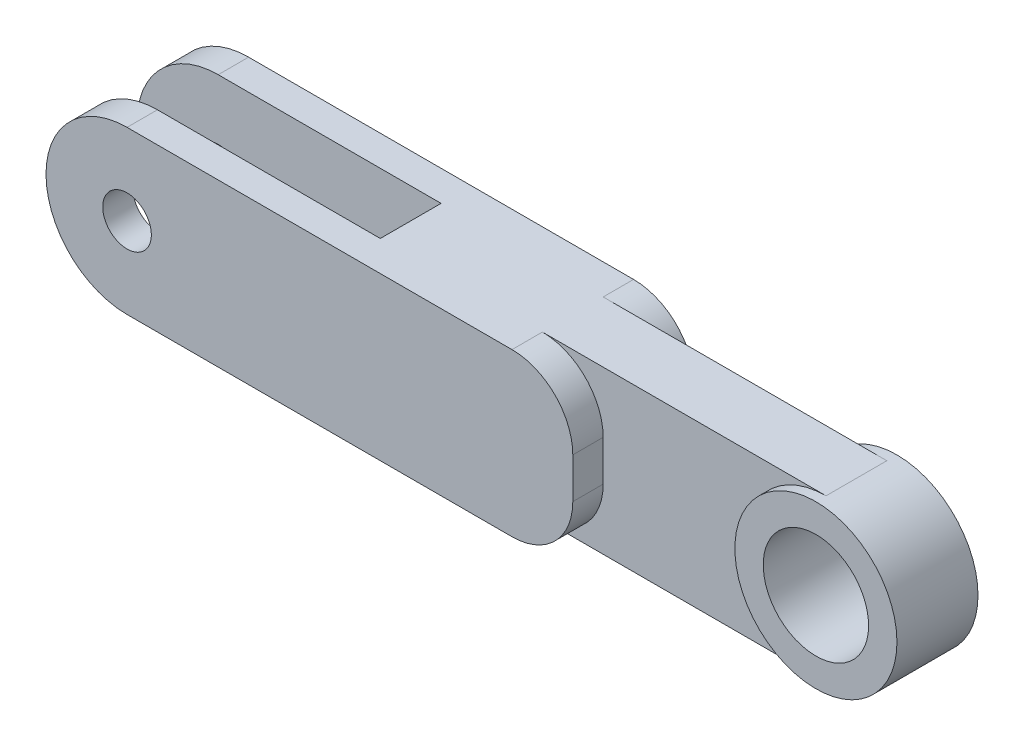
ISO-10303-21;
HEADER;
FILE_DESCRIPTION(('STEP AP214'),'2;1');
FILE_NAME('part.step','',(''),(''),'','','');
FILE_SCHEMA(('AUTOMOTIVE_DESIGN { 1 0 10303 214 1 1 1 1 }'));
ENDSEC;
DATA;
#1=APPLICATION_CONTEXT('core data for automotive mechanical design processes');
#2=APPLICATION_PROTOCOL_DEFINITION('international standard','automotive_design',2000,#1);
#3=PRODUCT_CONTEXT('',#1,'mechanical');
#4=PRODUCT('Part','Part','',(#3));
#5=PRODUCT_RELATED_PRODUCT_CATEGORY('part','',(#4));
#6=PRODUCT_DEFINITION_FORMATION('','',#4);
#7=PRODUCT_DEFINITION_CONTEXT('part definition',#1,'design');
#8=PRODUCT_DEFINITION('design','',#6,#7);
#9=PRODUCT_DEFINITION_SHAPE('','',#8);
#10=(LENGTH_UNIT() NAMED_UNIT(*) SI_UNIT(.MILLI.,.METRE.));
#11=(NAMED_UNIT(*) PLANE_ANGLE_UNIT() SI_UNIT($,.RADIAN.));
#12=(NAMED_UNIT(*) SI_UNIT($,.STERADIAN.) SOLID_ANGLE_UNIT());
#13=UNCERTAINTY_MEASURE_WITH_UNIT(LENGTH_MEASURE(1.E-05),#10,'distance_accuracy_value','');
#14=(GEOMETRIC_REPRESENTATION_CONTEXT(3) GLOBAL_UNCERTAINTY_ASSIGNED_CONTEXT((#13)) GLOBAL_UNIT_ASSIGNED_CONTEXT((#10,
#11,#12)) REPRESENTATION_CONTEXT('',''));
#15=CARTESIAN_POINT('',(0.,0.,0.));
#16=DIRECTION('',(0.,0.,1.));
#17=DIRECTION('',(1.,0.,0.));
#18=AXIS2_PLACEMENT_3D('',#15,#16,#17);
#19=CARTESIAN_POINT('',(9.6,6.,-0.899999999999998));
#20=DIRECTION('',(0.,0.,-1.));
#21=DIRECTION('',(-1.,0.,0.));
#22=AXIS2_PLACEMENT_3D('',#19,#20,#21);
#23=PLANE('',#22);
#24=DIRECTION('',(-1.,0.,0.));
#25=VECTOR('',#24,1.);
#26=CARTESIAN_POINT('',(-12.6,2.4,-0.899999999999996));
#27=LINE('',#26,#25);
#28=CARTESIAN_POINT('',(7.2,2.4,-0.899999999999998));
#29=VERTEX_POINT('',#28);
#30=CARTESIAN_POINT('',(-1.2,2.4,-0.899999999999997));
#31=VERTEX_POINT('',#30);
#32=EDGE_CURVE('E169',#29,#31,#27,.T.);
#33=ORIENTED_EDGE('',*,*,#32,.F.);
#34=CARTESIAN_POINT('',(7.2,0.,-0.899999999999998));
#35=DIRECTION('',(0.,0.,-1.));
#36=DIRECTION('',(-1.,0.,0.));
#37=AXIS2_PLACEMENT_3D('',#34,#35,#36);
#38=CIRCLE('',#37,2.4);
#39=CARTESIAN_POINT('',(7.2,-2.4,-0.899999999999998));
#40=VERTEX_POINT('',#39);
#41=EDGE_CURVE('E11',#29,#40,#38,.F.);
#42=ORIENTED_EDGE('',*,*,#41,.T.);
#43=DIRECTION('',(1.,0.,0.));
#44=VECTOR('',#43,1.);
#45=CARTESIAN_POINT('',(-12.6,-2.4,-0.899999999999996));
#46=LINE('',#45,#44);
#47=CARTESIAN_POINT('',(-1.2,-2.4,-0.899999999999997));
#48=VERTEX_POINT('',#47);
#49=EDGE_CURVE('E176',#48,#40,#46,.T.);
#50=ORIENTED_EDGE('',*,*,#49,.F.);
#51=CARTESIAN_POINT('',(-1.2,-0.6,-0.899999999999997));
#52=DIRECTION('',(0.,0.,-1.));
#53=DIRECTION('',(-1.,0.,0.));
#54=AXIS2_PLACEMENT_3D('',#51,#52,#53);
#55=CIRCLE('',#54,1.8);
#56=CARTESIAN_POINT('',(0.600000000000001,-0.6,-0.899999999999997));
#57=VERTEX_POINT('',#56);
#58=EDGE_CURVE('E235',#48,#57,#55,.F.);
#59=ORIENTED_EDGE('',*,*,#58,.T.);
#60=DIRECTION('',(0.,-1.,0.));
#61=VECTOR('',#60,1.);
#62=CARTESIAN_POINT('',(0.600000000000001,6.,-0.899999999999997));
#63=LINE('',#62,#61);
#64=CARTESIAN_POINT('',(0.600000000000001,0.6,-0.899999999999997));
#65=VERTEX_POINT('',#64);
#66=EDGE_CURVE('E238',#65,#57,#63,.T.);
#67=ORIENTED_EDGE('',*,*,#66,.F.);
#68=CARTESIAN_POINT('',(-1.2,0.6,-0.899999999999997));
#69=DIRECTION('',(0.,0.,-1.));
#70=DIRECTION('',(-1.,0.,0.));
#71=AXIS2_PLACEMENT_3D('',#68,#69,#70);
#72=CIRCLE('',#71,1.8);
#73=EDGE_CURVE('E54',#65,#31,#72,.F.);
#74=ORIENTED_EDGE('',*,*,#73,.T.);
#75=EDGE_LOOP('',(#33,#42,#50,#59,#67,#74));
#76=FACE_BOUND('',#75,.T.);
#77=ADVANCED_FACE('F45',(#76),#23,.T.);
#78=CARTESIAN_POINT('',(9.6,6.,0.900000000000002));
#79=DIRECTION('',(0.,0.,1.));
#80=DIRECTION('',(1.,0.,0.));
#81=AXIS2_PLACEMENT_3D('',#78,#79,#80);
#82=PLANE('',#81);
#83=DIRECTION('',(-1.,0.,0.));
#84=VECTOR('',#83,1.);
#85=CARTESIAN_POINT('',(-12.6,-2.4,0.900000000000004));
#86=LINE('',#85,#84);
#87=CARTESIAN_POINT('',(7.2,-2.4,0.900000000000002));
#88=VERTEX_POINT('',#87);
#89=CARTESIAN_POINT('',(-1.2,-2.4,0.900000000000003));
#90=VERTEX_POINT('',#89);
#91=EDGE_CURVE('E175',#88,#90,#86,.T.);
#92=ORIENTED_EDGE('',*,*,#91,.F.);
#93=CARTESIAN_POINT('',(7.2,0.,0.900000000000003));
#94=DIRECTION('',(0.,0.,1.));
#95=DIRECTION('',(1.,0.,0.));
#96=AXIS2_PLACEMENT_3D('',#93,#94,#95);
#97=CIRCLE('',#96,2.4);
#98=CARTESIAN_POINT('',(7.2,2.4,0.900000000000003));
#99=VERTEX_POINT('',#98);
#100=EDGE_CURVE('E302',#99,#88,#97,.T.);
#101=ORIENTED_EDGE('',*,*,#100,.F.);
#102=DIRECTION('',(1.,0.,0.));
#103=VECTOR('',#102,1.);
#104=CARTESIAN_POINT('',(-12.6,2.4,0.900000000000004));
#105=LINE('',#104,#103);
#106=CARTESIAN_POINT('',(-1.2,2.4,0.900000000000003));
#107=VERTEX_POINT('',#106);
#108=EDGE_CURVE('E182',#107,#99,#105,.T.);
#109=ORIENTED_EDGE('',*,*,#108,.F.);
#110=CARTESIAN_POINT('',(-1.2,0.6,0.900000000000003));
#111=DIRECTION('',(0.,0.,1.));
#112=DIRECTION('',(1.,0.,0.));
#113=AXIS2_PLACEMENT_3D('',#110,#111,#112);
#114=CIRCLE('',#113,1.8);
#115=CARTESIAN_POINT('',(0.600000000000001,0.6,0.900000000000003));
#116=VERTEX_POINT('',#115);
#117=EDGE_CURVE('E233',#107,#116,#114,.F.);
#118=ORIENTED_EDGE('',*,*,#117,.T.);
#119=DIRECTION('',(0.,-1.,0.));
#120=VECTOR('',#119,1.);
#121=CARTESIAN_POINT('',(0.600000000000001,6.,0.900000000000003));
#122=LINE('',#121,#120);
#123=CARTESIAN_POINT('',(0.600000000000001,-0.6,0.900000000000003));
#124=VERTEX_POINT('',#123);
#125=EDGE_CURVE('E294',#116,#124,#122,.T.);
#126=ORIENTED_EDGE('',*,*,#125,.T.);
#127=CARTESIAN_POINT('',(-1.2,-0.6,0.900000000000003));
#128=DIRECTION('',(0.,0.,1.));
#129=DIRECTION('',(1.,0.,0.));
#130=AXIS2_PLACEMENT_3D('',#127,#128,#129);
#131=CIRCLE('',#130,1.8);
#132=EDGE_CURVE('E230',#124,#90,#131,.F.);
#133=ORIENTED_EDGE('',*,*,#132,.T.);
#134=EDGE_LOOP('',(#92,#101,#109,#118,#126,#133));
#135=FACE_BOUND('',#134,.T.);
#136=ADVANCED_FACE('F359',(#135),#82,.T.);
#137=CARTESIAN_POINT('',(-12.6,0.,-1.8));
#138=DIRECTION('',(0.,0.,1.));
#139=DIRECTION('',(1.,0.,0.));
#140=AXIS2_PLACEMENT_3D('',#137,#138,#139);
#141=CYLINDRICAL_SURFACE('',#140,2.4);
#142=DIRECTION('',(0.,0.,1.));
#143=VECTOR('',#142,1.);
#144=CARTESIAN_POINT('',(-12.6,-2.4,-1.8));
#145=LINE('',#144,#143);
#146=CARTESIAN_POINT('',(-12.6,-2.4,-1.8));
#147=VERTEX_POINT('',#146);
#148=CARTESIAN_POINT('',(-12.6,-2.4,-0.899999999999998));
#149=VERTEX_POINT('',#148);
#150=EDGE_CURVE('E188',#147,#149,#145,.T.);
#151=ORIENTED_EDGE('',*,*,#150,.T.);
#152=CARTESIAN_POINT('',(-12.6,0.,-0.899999999999998));
#153=DIRECTION('',(0.,0.,1.));
#154=DIRECTION('',(1.,0.,0.));
#155=AXIS2_PLACEMENT_3D('',#152,#153,#154);
#156=CIRCLE('',#155,2.4);
#157=CARTESIAN_POINT('',(-12.6,2.4,-0.899999999999998));
#158=VERTEX_POINT('',#157);
#159=EDGE_CURVE('E279',#149,#158,#156,.F.);
#160=ORIENTED_EDGE('',*,*,#159,.T.);
#161=DIRECTION('',(0.,0.,1.));
#162=VECTOR('',#161,1.);
#163=CARTESIAN_POINT('',(-12.6,2.4,-1.8));
#164=LINE('',#163,#162);
#165=CARTESIAN_POINT('',(-12.6,2.4,-1.8));
#166=VERTEX_POINT('',#165);
#167=EDGE_CURVE('E186',#166,#158,#164,.T.);
#168=ORIENTED_EDGE('',*,*,#167,.F.);
#169=CARTESIAN_POINT('',(-12.6,0.,-1.8));
#170=DIRECTION('',(0.,0.,1.));
#171=DIRECTION('',(1.,0.,0.));
#172=AXIS2_PLACEMENT_3D('',#169,#170,#171);
#173=CIRCLE('',#172,2.4);
#174=EDGE_CURVE('E258',#166,#147,#173,.T.);
#175=ORIENTED_EDGE('',*,*,#174,.T.);
#176=EDGE_LOOP('',(#151,#160,#168,#175));
#177=FACE_BOUND('',#176,.T.);
#178=ADVANCED_FACE('F345',(#177),#141,.T.);
#179=CARTESIAN_POINT('',(-12.6,0.,0.900000000000002));
#180=DIRECTION('',(0.,0.,-1.));
#181=DIRECTION('',(-1.,0.,0.));
#182=AXIS2_PLACEMENT_3D('',#179,#180,#181);
#183=CIRCLE('',#182,2.4);
#184=CARTESIAN_POINT('',(-12.6,2.4,0.900000000000002));
#185=VERTEX_POINT('',#184);
#186=CARTESIAN_POINT('',(-12.6,-2.4,0.900000000000002));
#187=VERTEX_POINT('',#186);
#188=EDGE_CURVE('E285',#185,#187,#183,.F.);
#189=ORIENTED_EDGE('',*,*,#188,.T.);
#190=CARTESIAN_POINT('',(-12.6,-2.4,1.8));
#191=VERTEX_POINT('',#190);
#192=EDGE_CURVE('E194',#187,#191,#145,.T.);
#193=ORIENTED_EDGE('',*,*,#192,.T.);
#194=CARTESIAN_POINT('',(-12.6,0.,1.8));
#195=DIRECTION('',(0.,0.,1.));
#196=DIRECTION('',(1.,0.,0.));
#197=AXIS2_PLACEMENT_3D('',#194,#195,#196);
#198=CIRCLE('',#197,2.4);
#199=CARTESIAN_POINT('',(-12.6,2.4,1.8));
#200=VERTEX_POINT('',#199);
#201=EDGE_CURVE('E270',#200,#191,#198,.T.);
#202=ORIENTED_EDGE('',*,*,#201,.F.);
#203=EDGE_CURVE('E183',#185,#200,#164,.T.);
#204=ORIENTED_EDGE('',*,*,#203,.F.);
#205=EDGE_LOOP('',(#189,#193,#202,#204));
#206=FACE_BOUND('',#205,.T.);
#207=ADVANCED_FACE('F339',(#206),#141,.T.);
#208=CARTESIAN_POINT('',(-12.6,2.4,-1.8));
#209=DIRECTION('',(0.,1.,0.));
#210=DIRECTION('',(0.,0.,1.));
#211=AXIS2_PLACEMENT_3D('',#208,#209,#210);
#212=PLANE('',#211);
#213=DIRECTION('',(-1.,0.,0.));
#214=VECTOR('',#213,1.);
#215=CARTESIAN_POINT('',(-12.6,2.4,1.8));
#216=LINE('',#215,#214);
#217=CARTESIAN_POINT('',(-1.2,2.4,1.8));
#218=VERTEX_POINT('',#217);
#219=EDGE_CURVE('E265',#218,#200,#216,.T.);
#220=ORIENTED_EDGE('',*,*,#219,.F.);
#221=DIRECTION('',(0.,0.,-1.));
#222=VECTOR('',#221,1.);
#223=CARTESIAN_POINT('',(-1.2,2.4,-1.8));
#224=LINE('',#223,#222);
#225=EDGE_CURVE('E222',#218,#107,#224,.T.);
#226=ORIENTED_EDGE('',*,*,#225,.T.);
#227=ORIENTED_EDGE('',*,*,#108,.T.);
#228=DIRECTION('',(0.,0.,1.));
#229=VECTOR('',#228,1.);
#230=CARTESIAN_POINT('',(7.2,2.4,-1.8));
#231=LINE('',#230,#229);
#232=EDGE_CURVE('E163',#29,#99,#231,.T.);
#233=ORIENTED_EDGE('',*,*,#232,.F.);
#234=ORIENTED_EDGE('',*,*,#32,.T.);
#235=DIRECTION('',(0.,0.,-1.));
#236=VECTOR('',#235,1.);
#237=CARTESIAN_POINT('',(-1.2,2.4,-1.8));
#238=LINE('',#237,#236);
#239=CARTESIAN_POINT('',(-1.2,2.4,-1.8));
#240=VERTEX_POINT('',#239);
#241=EDGE_CURVE('E220',#31,#240,#238,.T.);
#242=ORIENTED_EDGE('',*,*,#241,.T.);
#243=DIRECTION('',(-1.,0.,0.));
#244=VECTOR('',#243,1.);
#245=CARTESIAN_POINT('',(-12.6,2.4,-1.8));
#246=LINE('',#245,#244);
#247=EDGE_CURVE('E257',#240,#166,#246,.T.);
#248=ORIENTED_EDGE('',*,*,#247,.T.);
#249=ORIENTED_EDGE('',*,*,#167,.T.);
#250=DIRECTION('',(1.,0.,0.));
#251=VECTOR('',#250,1.);
#252=CARTESIAN_POINT('',(-12.6,2.4,-0.899999999999998));
#253=LINE('',#252,#251);
#254=CARTESIAN_POINT('',(-6.,2.4,-0.899999999999998));
#255=VERTEX_POINT('',#254);
#256=EDGE_CURVE('E276',#158,#255,#253,.T.);
#257=ORIENTED_EDGE('',*,*,#256,.T.);
#258=DIRECTION('',(0.,0.,1.));
#259=VECTOR('',#258,1.);
#260=CARTESIAN_POINT('',(-6.,2.4,-1.8));
#261=LINE('',#260,#259);
#262=CARTESIAN_POINT('',(-6.,2.4,0.900000000000001));
#263=VERTEX_POINT('',#262);
#264=EDGE_CURVE('E273',#255,#263,#261,.T.);
#265=ORIENTED_EDGE('',*,*,#264,.T.);
#266=DIRECTION('',(-1.,0.,0.));
#267=VECTOR('',#266,1.);
#268=CARTESIAN_POINT('',(-12.6,2.4,0.900000000000002));
#269=LINE('',#268,#267);
#270=EDGE_CURVE('E203',#263,#185,#269,.T.);
#271=ORIENTED_EDGE('',*,*,#270,.T.);
#272=ORIENTED_EDGE('',*,*,#203,.T.);
#273=EDGE_LOOP('',(#220,#226,#227,#233,#234,#242,#248,#249,#257,#265,#271,#272));
#274=FACE_BOUND('',#273,.T.);
#275=ADVANCED_FACE('F180',(#274),#212,.T.);
#276=CARTESIAN_POINT('',(7.2,0.,-1.8));
#277=DIRECTION('',(0.,0.,1.));
#278=DIRECTION('',(1.,0.,0.));
#279=AXIS2_PLACEMENT_3D('',#276,#277,#278);
#280=CYLINDRICAL_SURFACE('',#279,2.4);
#281=ORIENTED_EDGE('',*,*,#232,.T.);
#282=ORIENTED_EDGE('',*,*,#100,.T.);
#283=DIRECTION('',(0.,0.,1.));
#284=VECTOR('',#283,1.);
#285=CARTESIAN_POINT('',(7.2,-2.4,-1.8));
#286=LINE('',#285,#284);
#287=EDGE_CURVE('E165',#40,#88,#286,.T.);
#288=ORIENTED_EDGE('',*,*,#287,.F.);
#289=ORIENTED_EDGE('',*,*,#41,.F.);
#290=EDGE_LOOP('',(#281,#282,#288,#289));
#291=FACE_BOUND('',#290,.T.);
#292=CARTESIAN_POINT('',(7.2,0.,1.2));
#293=DIRECTION('',(0.,0.,1.));
#294=DIRECTION('',(1.,0.,0.));
#295=AXIS2_PLACEMENT_3D('',#292,#293,#294);
#296=CIRCLE('',#295,2.4);
#297=CARTESIAN_POINT('',(9.6,0.,1.2));
#298=VERTEX_POINT('',#297);
#299=EDGE_CURVE('E244',#298,#298,#296,.T.);
#300=ORIENTED_EDGE('',*,*,#299,.F.);
#301=EDGE_LOOP('',(#300));
#302=FACE_BOUND('',#301,.T.);
#303=CARTESIAN_POINT('',(7.2,0.,-1.2));
#304=DIRECTION('',(0.,0.,-1.));
#305=DIRECTION('',(-1.,0.,0.));
#306=AXIS2_PLACEMENT_3D('',#303,#304,#305);
#307=CIRCLE('',#306,2.4);
#308=CARTESIAN_POINT('',(4.8,0.,-1.2));
#309=VERTEX_POINT('',#308);
#310=EDGE_CURVE('E309',#309,#309,#307,.T.);
#311=ORIENTED_EDGE('',*,*,#310,.F.);
#312=EDGE_LOOP('',(#311));
#313=FACE_BOUND('',#312,.T.);
#314=ADVANCED_FACE('F160',(#291,#302,#313),#280,.T.);
#315=CARTESIAN_POINT('',(-12.6,-2.4,-1.8));
#316=DIRECTION('',(0.,-1.,0.));
#317=DIRECTION('',(0.,0.,-1.));
#318=AXIS2_PLACEMENT_3D('',#315,#316,#317);
#319=PLANE('',#318);
#320=ORIENTED_EDGE('',*,*,#91,.T.);
#321=DIRECTION('',(0.,0.,1.));
#322=VECTOR('',#321,1.);
#323=CARTESIAN_POINT('',(-1.2,-2.4,-1.8));
#324=LINE('',#323,#322);
#325=CARTESIAN_POINT('',(-1.2,-2.4,1.8));
#326=VERTEX_POINT('',#325);
#327=EDGE_CURVE('E209',#90,#326,#324,.T.);
#328=ORIENTED_EDGE('',*,*,#327,.T.);
#329=DIRECTION('',(1.,0.,0.));
#330=VECTOR('',#329,1.);
#331=CARTESIAN_POINT('',(-12.6,-2.4,1.8));
#332=LINE('',#331,#330);
#333=EDGE_CURVE('E267',#191,#326,#332,.T.);
#334=ORIENTED_EDGE('',*,*,#333,.F.);
#335=ORIENTED_EDGE('',*,*,#192,.F.);
#336=DIRECTION('',(1.,0.,0.));
#337=VECTOR('',#336,1.);
#338=CARTESIAN_POINT('',(-12.6,-2.4,0.900000000000002));
#339=LINE('',#338,#337);
#340=CARTESIAN_POINT('',(-6.,-2.4,0.900000000000002));
#341=VERTEX_POINT('',#340);
#342=EDGE_CURVE('E287',#187,#341,#339,.T.);
#343=ORIENTED_EDGE('',*,*,#342,.T.);
#344=DIRECTION('',(0.,0.,-1.));
#345=VECTOR('',#344,1.);
#346=CARTESIAN_POINT('',(-6.,-2.4,-1.8));
#347=LINE('',#346,#345);
#348=CARTESIAN_POINT('',(-6.,-2.4,-0.899999999999998));
#349=VERTEX_POINT('',#348);
#350=EDGE_CURVE('E198',#341,#349,#347,.T.);
#351=ORIENTED_EDGE('',*,*,#350,.T.);
#352=DIRECTION('',(-1.,0.,0.));
#353=VECTOR('',#352,1.);
#354=CARTESIAN_POINT('',(-12.6,-2.4,-0.899999999999998));
#355=LINE('',#354,#353);
#356=EDGE_CURVE('E202',#349,#149,#355,.T.);
#357=ORIENTED_EDGE('',*,*,#356,.T.);
#358=ORIENTED_EDGE('',*,*,#150,.F.);
#359=DIRECTION('',(1.,0.,0.));
#360=VECTOR('',#359,1.);
#361=CARTESIAN_POINT('',(-12.6,-2.4,-1.8));
#362=LINE('',#361,#360);
#363=CARTESIAN_POINT('',(-1.2,-2.4,-1.8));
#364=VERTEX_POINT('',#363);
#365=EDGE_CURVE('E252',#147,#364,#362,.T.);
#366=ORIENTED_EDGE('',*,*,#365,.T.);
#367=DIRECTION('',(0.,0.,1.));
#368=VECTOR('',#367,1.);
#369=CARTESIAN_POINT('',(-1.2,-2.4,-1.8));
#370=LINE('',#369,#368);
#371=EDGE_CURVE('E206',#364,#48,#370,.T.);
#372=ORIENTED_EDGE('',*,*,#371,.T.);
#373=ORIENTED_EDGE('',*,*,#49,.T.);
#374=ORIENTED_EDGE('',*,*,#287,.T.);
#375=EDGE_LOOP('',(#320,#328,#334,#335,#343,#351,#357,#358,#366,#372,#373,#374));
#376=FACE_BOUND('',#375,.T.);
#377=ADVANCED_FACE('F255',(#376),#319,.T.);
#378=CARTESIAN_POINT('',(-12.6,0.,-1.8));
#379=DIRECTION('',(0.,0.,1.));
#380=DIRECTION('',(1.,0.,0.));
#381=AXIS2_PLACEMENT_3D('',#378,#379,#380);
#382=PLANE('',#381);
#383=CARTESIAN_POINT('',(-12.6,0.,-1.8));
#384=DIRECTION('',(0.,0.,1.));
#385=DIRECTION('',(1.,0.,0.));
#386=AXIS2_PLACEMENT_3D('',#383,#384,#385);
#387=CIRCLE('',#386,0.615);
#388=CARTESIAN_POINT('',(-11.985,0.,-1.8));
#389=VERTEX_POINT('',#388);
#390=EDGE_CURVE('E260',#389,#389,#387,.T.);
#391=ORIENTED_EDGE('',*,*,#390,.T.);
#392=EDGE_LOOP('',(#391));
#393=FACE_BOUND('',#392,.T.);
#394=DIRECTION('',(0.,-1.,0.));
#395=VECTOR('',#394,1.);
#396=CARTESIAN_POINT('',(0.600000000000001,6.,-1.8));
#397=LINE('',#396,#395);
#398=CARTESIAN_POINT('',(0.600000000000001,0.6,-1.8));
#399=VERTEX_POINT('',#398);
#400=CARTESIAN_POINT('',(0.600000000000001,-0.6,-1.8));
#401=VERTEX_POINT('',#400);
#402=EDGE_CURVE('E243',#399,#401,#397,.T.);
#403=ORIENTED_EDGE('',*,*,#402,.T.);
#404=CARTESIAN_POINT('',(-1.2,-0.6,-1.8));
#405=DIRECTION('',(0.,0.,1.));
#406=DIRECTION('',(1.,0.,0.));
#407=AXIS2_PLACEMENT_3D('',#404,#405,#406);
#408=CIRCLE('',#407,1.8);
#409=EDGE_CURVE('E228',#401,#364,#408,.F.);
#410=ORIENTED_EDGE('',*,*,#409,.T.);
#411=ORIENTED_EDGE('',*,*,#365,.F.);
#412=ORIENTED_EDGE('',*,*,#174,.F.);
#413=ORIENTED_EDGE('',*,*,#247,.F.);
#414=CARTESIAN_POINT('',(-1.2,0.6,-1.8));
#415=DIRECTION('',(0.,0.,1.));
#416=DIRECTION('',(1.,0.,0.));
#417=AXIS2_PLACEMENT_3D('',#414,#415,#416);
#418=CIRCLE('',#417,1.8);
#419=EDGE_CURVE('E68',#240,#399,#418,.F.);
#420=ORIENTED_EDGE('',*,*,#419,.T.);
#421=EDGE_LOOP('',(#403,#410,#411,#412,#413,#420));
#422=FACE_BOUND('',#421,.T.);
#423=ADVANCED_FACE('F250',(#393,#422),#382,.F.);
#424=CARTESIAN_POINT('',(-12.6,0.,-1.8));
#425=DIRECTION('',(0.,0.,1.));
#426=DIRECTION('',(1.,0.,0.));
#427=AXIS2_PLACEMENT_3D('',#424,#425,#426);
#428=CYLINDRICAL_SURFACE('',#427,0.615);
#429=ORIENTED_EDGE('',*,*,#390,.F.);
#430=EDGE_LOOP('',(#429));
#431=FACE_BOUND('',#430,.T.);
#432=CARTESIAN_POINT('',(-12.6,0.,-0.899999999999998));
#433=DIRECTION('',(0.,0.,1.));
#434=DIRECTION('',(1.,0.,0.));
#435=AXIS2_PLACEMENT_3D('',#432,#433,#434);
#436=CIRCLE('',#435,0.615);
#437=CARTESIAN_POINT('',(-11.985,0.,-0.899999999999998));
#438=VERTEX_POINT('',#437);
#439=EDGE_CURVE('E199',#438,#438,#436,.F.);
#440=ORIENTED_EDGE('',*,*,#439,.F.);
#441=EDGE_LOOP('',(#440));
#442=FACE_BOUND('',#441,.T.);
#443=ADVANCED_FACE('F375',(#431,#442),#428,.F.);
#444=CARTESIAN_POINT('',(-12.6,0.,1.8));
#445=DIRECTION('',(0.,0.,1.));
#446=DIRECTION('',(1.,0.,0.));
#447=AXIS2_PLACEMENT_3D('',#444,#445,#446);
#448=PLANE('',#447);
#449=CARTESIAN_POINT('',(-12.6,0.,1.8));
#450=DIRECTION('',(0.,0.,1.));
#451=DIRECTION('',(1.,0.,0.));
#452=AXIS2_PLACEMENT_3D('',#449,#450,#451);
#453=CIRCLE('',#452,0.72);
#454=CARTESIAN_POINT('',(-11.88,0.,1.8));
#455=VERTEX_POINT('',#454);
#456=EDGE_CURVE('E315',#455,#455,#453,.T.);
#457=ORIENTED_EDGE('',*,*,#456,.F.);
#458=EDGE_LOOP('',(#457));
#459=FACE_BOUND('',#458,.T.);
#460=ORIENTED_EDGE('',*,*,#333,.T.);
#461=CARTESIAN_POINT('',(-1.2,-0.6,1.8));
#462=DIRECTION('',(0.,0.,1.));
#463=DIRECTION('',(1.,0.,0.));
#464=AXIS2_PLACEMENT_3D('',#461,#462,#463);
#465=CIRCLE('',#464,1.8);
#466=CARTESIAN_POINT('',(0.600000000000001,-0.6,1.8));
#467=VERTEX_POINT('',#466);
#468=EDGE_CURVE('E214',#326,#467,#465,.T.);
#469=ORIENTED_EDGE('',*,*,#468,.T.);
#470=DIRECTION('',(0.,1.,0.));
#471=VECTOR('',#470,1.);
#472=CARTESIAN_POINT('',(0.600000000000001,0.,1.8));
#473=LINE('',#472,#471);
#474=CARTESIAN_POINT('',(0.600000000000001,0.6,1.8));
#475=VERTEX_POINT('',#474);
#476=EDGE_CURVE('E195',#467,#475,#473,.T.);
#477=ORIENTED_EDGE('',*,*,#476,.T.);
#478=CARTESIAN_POINT('',(-1.2,0.6,1.8));
#479=DIRECTION('',(0.,0.,1.));
#480=DIRECTION('',(1.,0.,0.));
#481=AXIS2_PLACEMENT_3D('',#478,#479,#480);
#482=CIRCLE('',#481,1.8);
#483=EDGE_CURVE('E212',#475,#218,#482,.T.);
#484=ORIENTED_EDGE('',*,*,#483,.T.);
#485=ORIENTED_EDGE('',*,*,#219,.T.);
#486=ORIENTED_EDGE('',*,*,#201,.T.);
#487=EDGE_LOOP('',(#460,#469,#477,#484,#485,#486));
#488=FACE_BOUND('',#487,.T.);
#489=ADVANCED_FACE('F371',(#459,#488),#448,.T.);
#490=CARTESIAN_POINT('',(0.600000000000001,6.,1.8));
#491=DIRECTION('',(1.,0.,0.));
#492=DIRECTION('',(0.,0.,-1.));
#493=AXIS2_PLACEMENT_3D('',#490,#491,#492);
#494=PLANE('',#493);
#495=ORIENTED_EDGE('',*,*,#476,.F.);
#496=DIRECTION('',(0.,0.,1.));
#497=VECTOR('',#496,1.);
#498=CARTESIAN_POINT('',(0.600000000000001,-0.6,1.8));
#499=LINE('',#498,#497);
#500=EDGE_CURVE('E218',#467,#124,#499,.F.);
#501=ORIENTED_EDGE('',*,*,#500,.T.);
#502=ORIENTED_EDGE('',*,*,#125,.F.);
#503=DIRECTION('',(0.,0.,-1.));
#504=VECTOR('',#503,1.);
#505=CARTESIAN_POINT('',(0.600000000000001,0.6,1.8));
#506=LINE('',#505,#504);
#507=EDGE_CURVE('E216',#116,#475,#506,.F.);
#508=ORIENTED_EDGE('',*,*,#507,.T.);
#509=EDGE_LOOP('',(#495,#501,#502,#508));
#510=FACE_BOUND('',#509,.T.);
#511=ADVANCED_FACE('F374',(#510),#494,.T.);
#512=CARTESIAN_POINT('',(7.2,0.,-1.8));
#513=DIRECTION('',(0.,0.,1.));
#514=DIRECTION('',(1.,0.,0.));
#515=AXIS2_PLACEMENT_3D('',#512,#513,#514);
#516=CYLINDRICAL_SURFACE('',#515,1.56);
#517=CARTESIAN_POINT('',(7.2,0.,1.2));
#518=DIRECTION('',(0.,0.,1.));
#519=DIRECTION('',(1.,0.,0.));
#520=AXIS2_PLACEMENT_3D('',#517,#518,#519);
#521=CIRCLE('',#520,1.56);
#522=CARTESIAN_POINT('',(8.76,0.,1.2));
#523=VERTEX_POINT('',#522);
#524=EDGE_CURVE('E304',#523,#523,#521,.T.);
#525=ORIENTED_EDGE('',*,*,#524,.T.);
#526=EDGE_LOOP('',(#525));
#527=FACE_BOUND('',#526,.T.);
#528=CARTESIAN_POINT('',(7.2,0.,-1.2));
#529=DIRECTION('',(0.,0.,-1.));
#530=DIRECTION('',(-1.,0.,0.));
#531=AXIS2_PLACEMENT_3D('',#528,#529,#530);
#532=CIRCLE('',#531,1.56);
#533=CARTESIAN_POINT('',(5.64,0.,-1.2));
#534=VERTEX_POINT('',#533);
#535=EDGE_CURVE('E312',#534,#534,#532,.T.);
#536=ORIENTED_EDGE('',*,*,#535,.T.);
#537=EDGE_LOOP('',(#536));
#538=FACE_BOUND('',#537,.T.);
#539=ADVANCED_FACE('F370',(#527,#538),#516,.F.);
#540=CARTESIAN_POINT('',(0.600000000000001,6.,-1.8));
#541=DIRECTION('',(1.,0.,0.));
#542=DIRECTION('',(0.,0.,-1.));
#543=AXIS2_PLACEMENT_3D('',#540,#541,#542);
#544=PLANE('',#543);
#545=ORIENTED_EDGE('',*,*,#66,.T.);
#546=DIRECTION('',(0.,0.,1.));
#547=VECTOR('',#546,1.);
#548=CARTESIAN_POINT('',(0.600000000000001,-0.6,-1.8));
#549=LINE('',#548,#547);
#550=EDGE_CURVE('E61',#57,#401,#549,.F.);
#551=ORIENTED_EDGE('',*,*,#550,.T.);
#552=ORIENTED_EDGE('',*,*,#402,.F.);
#553=DIRECTION('',(0.,0.,-1.));
#554=VECTOR('',#553,1.);
#555=CARTESIAN_POINT('',(0.600000000000001,0.6,-1.8));
#556=LINE('',#555,#554);
#557=EDGE_CURVE('E224',#399,#65,#556,.F.);
#558=ORIENTED_EDGE('',*,*,#557,.T.);
#559=EDGE_LOOP('',(#545,#551,#552,#558));
#560=FACE_BOUND('',#559,.T.);
#561=ADVANCED_FACE('F241',(#560),#544,.T.);
#562=CARTESIAN_POINT('',(-15.,6.,-0.899999999999998));
#563=DIRECTION('',(0.,0.,1.));
#564=DIRECTION('',(1.,0.,0.));
#565=AXIS2_PLACEMENT_3D('',#562,#563,#564);
#566=PLANE('',#565);
#567=ORIENTED_EDGE('',*,*,#159,.F.);
#568=ORIENTED_EDGE('',*,*,#356,.F.);
#569=DIRECTION('',(0.,-1.,0.));
#570=VECTOR('',#569,1.);
#571=CARTESIAN_POINT('',(-6.,6.,-0.899999999999998));
#572=LINE('',#571,#570);
#573=EDGE_CURVE('E293',#255,#349,#572,.T.);
#574=ORIENTED_EDGE('',*,*,#573,.F.);
#575=ORIENTED_EDGE('',*,*,#256,.F.);
#576=EDGE_LOOP('',(#567,#568,#574,#575));
#577=FACE_BOUND('',#576,.T.);
#578=ORIENTED_EDGE('',*,*,#439,.T.);
#579=EDGE_LOOP('',(#578));
#580=FACE_BOUND('',#579,.T.);
#581=ADVANCED_FACE('F328',(#577,#580),#566,.T.);
#582=CARTESIAN_POINT('',(-15.,6.,0.900000000000002));
#583=DIRECTION('',(0.,0.,-1.));
#584=DIRECTION('',(-1.,0.,0.));
#585=AXIS2_PLACEMENT_3D('',#582,#583,#584);
#586=PLANE('',#585);
#587=CARTESIAN_POINT('',(-12.6,0.,0.900000000000001));
#588=DIRECTION('',(0.,0.,-1.));
#589=DIRECTION('',(-1.,0.,0.));
#590=AXIS2_PLACEMENT_3D('',#587,#588,#589);
#591=CIRCLE('',#590,0.72);
#592=CARTESIAN_POINT('',(-13.32,0.,0.900000000000001));
#593=VERTEX_POINT('',#592);
#594=EDGE_CURVE('E49',#593,#593,#591,.T.);
#595=ORIENTED_EDGE('',*,*,#594,.F.);
#596=EDGE_LOOP('',(#595));
#597=FACE_BOUND('',#596,.T.);
#598=DIRECTION('',(0.,-1.,0.));
#599=VECTOR('',#598,1.);
#600=CARTESIAN_POINT('',(-6.,6.,0.900000000000001));
#601=LINE('',#600,#599);
#602=EDGE_CURVE('E298',#263,#341,#601,.T.);
#603=ORIENTED_EDGE('',*,*,#602,.T.);
#604=ORIENTED_EDGE('',*,*,#342,.F.);
#605=ORIENTED_EDGE('',*,*,#188,.F.);
#606=ORIENTED_EDGE('',*,*,#270,.F.);
#607=EDGE_LOOP('',(#603,#604,#605,#606));
#608=FACE_BOUND('',#607,.T.);
#609=ADVANCED_FACE('F324',(#597,#608),#586,.T.);
#610=CARTESIAN_POINT('',(-6.,6.,-0.899999999999998));
#611=DIRECTION('',(-1.,0.,0.));
#612=DIRECTION('',(0.,0.,1.));
#613=AXIS2_PLACEMENT_3D('',#610,#611,#612);
#614=PLANE('',#613);
#615=ORIENTED_EDGE('',*,*,#573,.T.);
#616=ORIENTED_EDGE('',*,*,#350,.F.);
#617=ORIENTED_EDGE('',*,*,#602,.F.);
#618=ORIENTED_EDGE('',*,*,#264,.F.);
#619=EDGE_LOOP('',(#615,#616,#617,#618));
#620=FACE_BOUND('',#619,.T.);
#621=ADVANCED_FACE('F327',(#620),#614,.T.);
#622=CARTESIAN_POINT('',(-1.2,-0.6,-1.8));
#623=DIRECTION('',(0.,0.,1.));
#624=DIRECTION('',(1.,0.,0.));
#625=AXIS2_PLACEMENT_3D('',#622,#623,#624);
#626=CYLINDRICAL_SURFACE('',#625,1.8);
#627=ORIENTED_EDGE('',*,*,#132,.F.);
#628=ORIENTED_EDGE('',*,*,#500,.F.);
#629=ORIENTED_EDGE('',*,*,#468,.F.);
#630=ORIENTED_EDGE('',*,*,#327,.F.);
#631=EDGE_LOOP('',(#627,#628,#629,#630));
#632=FACE_BOUND('',#631,.T.);
#633=ADVANCED_FACE('F394',(#632),#626,.T.);
#634=CARTESIAN_POINT('',(-1.2,0.6,-1.8));
#635=DIRECTION('',(0.,0.,-1.));
#636=DIRECTION('',(-1.,0.,0.));
#637=AXIS2_PLACEMENT_3D('',#634,#635,#636);
#638=CYLINDRICAL_SURFACE('',#637,1.8);
#639=ORIENTED_EDGE('',*,*,#483,.F.);
#640=ORIENTED_EDGE('',*,*,#507,.F.);
#641=ORIENTED_EDGE('',*,*,#117,.F.);
#642=ORIENTED_EDGE('',*,*,#225,.F.);
#643=EDGE_LOOP('',(#639,#640,#641,#642));
#644=FACE_BOUND('',#643,.T.);
#645=ADVANCED_FACE('F357',(#644),#638,.T.);
#646=CARTESIAN_POINT('',(-1.2,-0.6,-1.8));
#647=DIRECTION('',(0.,0.,1.));
#648=DIRECTION('',(1.,0.,0.));
#649=AXIS2_PLACEMENT_3D('',#646,#647,#648);
#650=CYLINDRICAL_SURFACE('',#649,1.8);
#651=ORIENTED_EDGE('',*,*,#409,.F.);
#652=ORIENTED_EDGE('',*,*,#550,.F.);
#653=ORIENTED_EDGE('',*,*,#58,.F.);
#654=ORIENTED_EDGE('',*,*,#371,.F.);
#655=EDGE_LOOP('',(#651,#652,#653,#654));
#656=FACE_BOUND('',#655,.T.);
#657=ADVANCED_FACE('F247',(#656),#650,.T.);
#658=CARTESIAN_POINT('',(-1.2,0.6,-1.8));
#659=DIRECTION('',(0.,0.,-1.));
#660=DIRECTION('',(-1.,0.,0.));
#661=AXIS2_PLACEMENT_3D('',#658,#659,#660);
#662=CYLINDRICAL_SURFACE('',#661,1.8);
#663=ORIENTED_EDGE('',*,*,#73,.F.);
#664=ORIENTED_EDGE('',*,*,#557,.F.);
#665=ORIENTED_EDGE('',*,*,#419,.F.);
#666=ORIENTED_EDGE('',*,*,#241,.F.);
#667=EDGE_LOOP('',(#663,#664,#665,#666));
#668=FACE_BOUND('',#667,.T.);
#669=ADVANCED_FACE('F47',(#668),#662,.T.);
#670=CARTESIAN_POINT('',(7.2,0.,1.2));
#671=DIRECTION('',(0.,0.,1.));
#672=DIRECTION('',(1.,0.,0.));
#673=AXIS2_PLACEMENT_3D('',#670,#671,#672);
#674=PLANE('',#673);
#675=ORIENTED_EDGE('',*,*,#299,.T.);
#676=EDGE_LOOP('',(#675));
#677=FACE_BOUND('',#676,.T.);
#678=ORIENTED_EDGE('',*,*,#524,.F.);
#679=EDGE_LOOP('',(#678));
#680=FACE_BOUND('',#679,.T.);
#681=ADVANCED_FACE('F349',(#677,#680),#674,.T.);
#682=CARTESIAN_POINT('',(7.2,0.,-1.2));
#683=DIRECTION('',(0.,0.,-1.));
#684=DIRECTION('',(-1.,0.,0.));
#685=AXIS2_PLACEMENT_3D('',#682,#683,#684);
#686=PLANE('',#685);
#687=ORIENTED_EDGE('',*,*,#310,.T.);
#688=EDGE_LOOP('',(#687));
#689=FACE_BOUND('',#688,.T.);
#690=ORIENTED_EDGE('',*,*,#535,.F.);
#691=EDGE_LOOP('',(#690));
#692=FACE_BOUND('',#691,.T.);
#693=ADVANCED_FACE('F354',(#689,#692),#686,.T.);
#694=CARTESIAN_POINT('',(-12.6,0.,0.6));
#695=DIRECTION('',(0.,0.,1.));
#696=DIRECTION('',(1.,0.,0.));
#697=AXIS2_PLACEMENT_3D('',#694,#695,#696);
#698=CYLINDRICAL_SURFACE('',#697,0.72);
#699=ORIENTED_EDGE('',*,*,#594,.T.);
#700=EDGE_LOOP('',(#699));
#701=FACE_BOUND('',#700,.T.);
#702=ORIENTED_EDGE('',*,*,#456,.T.);
#703=EDGE_LOOP('',(#702));
#704=FACE_BOUND('',#703,.T.);
#705=ADVANCED_FACE('F322',(#701,#704),#698,.F.);
#706=CLOSED_SHELL('',(#77,#136,#178,#207,#275,#314,#377,#423,#443,#489,#511,#539,#561,#581,#609,
#621,#633,#645,#657,#669,#681,#693,#705));
#707=MANIFOLD_SOLID_BREP('B2',#706);
#708=ADVANCED_BREP_SHAPE_REPRESENTATION('',(#18,#707),#14);
#709=SHAPE_DEFINITION_REPRESENTATION(#9,#708);
ENDSEC;
END-ISO-10303-21;
